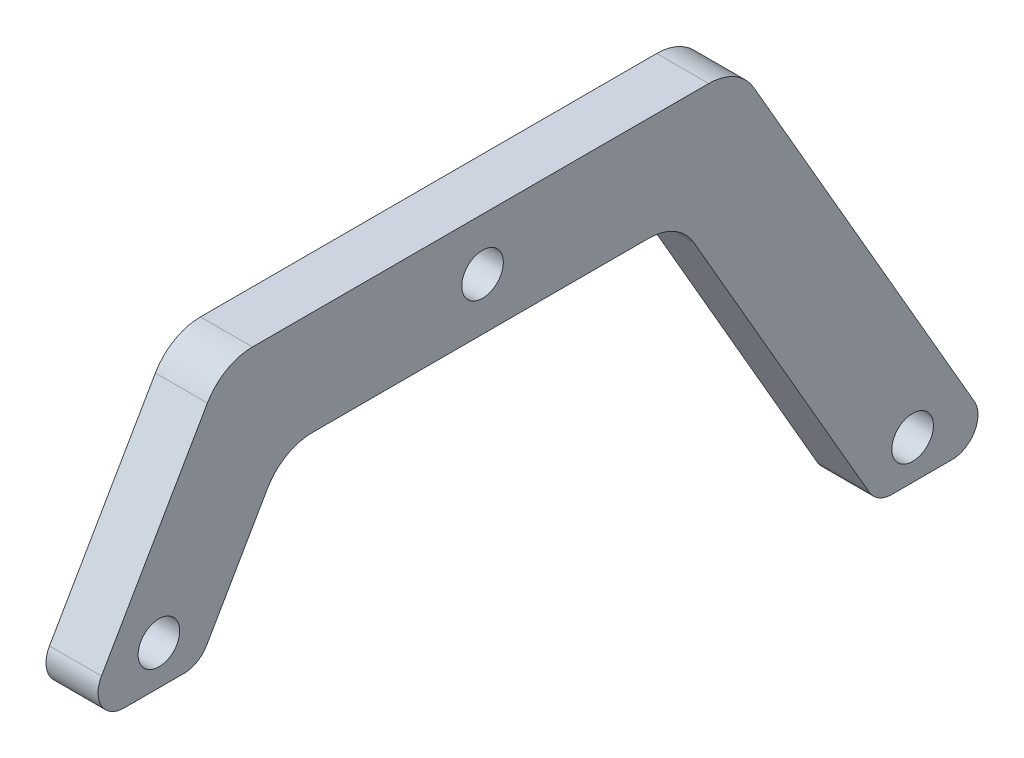
ISO-10303-21;
HEADER;
FILE_DESCRIPTION(('STEP AP214'),'2;1');
FILE_NAME('part.step','',(''),(''),'','','');
FILE_SCHEMA(('AUTOMOTIVE_DESIGN { 1 0 10303 214 1 1 1 1 }'));
ENDSEC;
DATA;
#1=APPLICATION_CONTEXT('core data for automotive mechanical design processes');
#2=APPLICATION_PROTOCOL_DEFINITION('international standard','automotive_design',2000,#1);
#3=PRODUCT_CONTEXT('',#1,'mechanical');
#4=PRODUCT('Part','Part','',(#3));
#5=PRODUCT_RELATED_PRODUCT_CATEGORY('part','',(#4));
#6=PRODUCT_DEFINITION_FORMATION('','',#4);
#7=PRODUCT_DEFINITION_CONTEXT('part definition',#1,'design');
#8=PRODUCT_DEFINITION('design','',#6,#7);
#9=PRODUCT_DEFINITION_SHAPE('','',#8);
#10=(LENGTH_UNIT() NAMED_UNIT(*) SI_UNIT(.MILLI.,.METRE.));
#11=(NAMED_UNIT(*) PLANE_ANGLE_UNIT() SI_UNIT($,.RADIAN.));
#12=(NAMED_UNIT(*) SI_UNIT($,.STERADIAN.) SOLID_ANGLE_UNIT());
#13=UNCERTAINTY_MEASURE_WITH_UNIT(LENGTH_MEASURE(1.E-05),#10,'distance_accuracy_value','');
#14=(GEOMETRIC_REPRESENTATION_CONTEXT(3) GLOBAL_UNCERTAINTY_ASSIGNED_CONTEXT((#13)) GLOBAL_UNIT_ASSIGNED_CONTEXT((#10,
#11,#12)) REPRESENTATION_CONTEXT('',''));
#15=CARTESIAN_POINT('',(0.,0.,0.));
#16=DIRECTION('',(0.,0.,1.));
#17=DIRECTION('',(1.,0.,0.));
#18=AXIS2_PLACEMENT_3D('',#15,#16,#17);
#19=CARTESIAN_POINT('',(20.,127.574851285857,-114.228325360805));
#20=DIRECTION('',(-1.,0.,0.));
#21=DIRECTION('',(0.,0.,1.));
#22=AXIS2_PLACEMENT_3D('',#19,#20,#21);
#23=PLANE('',#22);
#24=CARTESIAN_POINT('',(20.,127.574851285857,-114.228325360805));
#25=DIRECTION('',(1.,0.,0.));
#26=DIRECTION('',(0.,0.,1.));
#27=AXIS2_PLACEMENT_3D('',#24,#25,#26);
#28=CIRCLE('',#27,20.0000000000001);
#29=CARTESIAN_POINT('',(20.,137.574851285857,-131.548833436493));
#30=VERTEX_POINT('',#29);
#31=CARTESIAN_POINT('',(20.,147.574851285857,-114.228325360805));
#32=VERTEX_POINT('',#31);
#33=EDGE_CURVE('E217',#30,#32,#28,.T.);
#34=ORIENTED_EDGE('',*,*,#33,.T.);
#35=DIRECTION('',(0.,0.,1.));
#36=VECTOR('',#35,1.);
#37=CARTESIAN_POINT('',(20.,147.574851285857,61.1416228554857));
#38=LINE('',#37,#36);
#39=CARTESIAN_POINT('',(20.,147.574851285857,61.1416228554857));
#40=VERTEX_POINT('',#39);
#41=EDGE_CURVE('E125',#32,#40,#38,.T.);
#42=ORIENTED_EDGE('',*,*,#41,.T.);
#43=CARTESIAN_POINT('',(20.,127.574851285857,61.1416228554857));
#44=DIRECTION('',(1.,0.,0.));
#45=DIRECTION('',(0.,0.,1.));
#46=AXIS2_PLACEMENT_3D('',#43,#44,#45);
#47=CIRCLE('',#46,20.0000000000001);
#48=CARTESIAN_POINT('',(20.,137.574851285857,78.4621309311745));
#49=VERTEX_POINT('',#48);
#50=EDGE_CURVE('E256',#40,#49,#47,.T.);
#51=ORIENTED_EDGE('',*,*,#50,.T.);
#52=DIRECTION('',(0.,-0.86602540378444,0.499999999999997));
#53=VECTOR('',#52,1.);
#54=CARTESIAN_POINT('',(20.,67.0522492484334,119.178374201434));
#55=LINE('',#54,#53);
#56=CARTESIAN_POINT('',(20.,67.0522492484334,119.178374201434));
#57=VERTEX_POINT('',#56);
#58=EDGE_CURVE('E275',#49,#57,#55,.T.);
#59=ORIENTED_EDGE('',*,*,#58,.T.);
#60=CARTESIAN_POINT('',(20.,62.0522492484333,110.518120163589));
#61=DIRECTION('',(1.,0.,0.));
#62=DIRECTION('',(0.,0.,-1.));
#63=AXIS2_PLACEMENT_3D('',#60,#61,#62);
#64=CIRCLE('',#63,10.);
#65=CARTESIAN_POINT('',(20.,52.0522492484333,110.518120163589));
#66=VERTEX_POINT('',#65);
#67=EDGE_CURVE('E272',#57,#66,#64,.T.);
#68=ORIENTED_EDGE('',*,*,#67,.T.);
#69=DIRECTION('',(0.,0.,-1.));
#70=VECTOR('',#69,1.);
#71=CARTESIAN_POINT('',(20.,52.0522492484334,87.4241093960043));
#72=LINE('',#71,#70);
#73=CARTESIAN_POINT('',(20.,52.0522492484334,87.4241093960043));
#74=VERTEX_POINT('',#73);
#75=EDGE_CURVE('E274',#66,#74,#72,.T.);
#76=ORIENTED_EDGE('',*,*,#75,.T.);
#77=CARTESIAN_POINT('',(20.,62.0522492484333,87.4241093960043));
#78=DIRECTION('',(1.,0.,0.));
#79=DIRECTION('',(0.,0.,1.));
#80=AXIS2_PLACEMENT_3D('',#77,#78,#79);
#81=CIRCLE('',#80,9.99999999999995);
#82=CARTESIAN_POINT('',(20.,57.0522492484334,78.7638553581599));
#83=VERTEX_POINT('',#82);
#84=EDGE_CURVE('E277',#74,#83,#81,.T.);
#85=ORIENTED_EDGE('',*,*,#84,.T.);
#86=DIRECTION('',(0.,0.86602540378444,-0.499999999999998));
#87=VECTOR('',#86,1.);
#88=CARTESIAN_POINT('',(20.,97.5748512858571,55.3681201635894));
#89=LINE('',#88,#87);
#90=CARTESIAN_POINT('',(20.,97.5748512858571,55.3681201635894));
#91=VERTEX_POINT('',#90);
#92=EDGE_CURVE('E283',#83,#91,#89,.T.);
#93=ORIENTED_EDGE('',*,*,#92,.T.);
#94=CARTESIAN_POINT('',(20.,87.5748512858571,38.0476120879007));
#95=DIRECTION('',(-1.,0.,0.));
#96=DIRECTION('',(0.,0.,-1.));
#97=AXIS2_PLACEMENT_3D('',#94,#95,#96);
#98=CIRCLE('',#97,20.0000000000001);
#99=CARTESIAN_POINT('',(20.,107.574851285857,38.0476120879006));
#100=VERTEX_POINT('',#99);
#101=EDGE_CURVE('E285',#91,#100,#98,.T.);
#102=ORIENTED_EDGE('',*,*,#101,.T.);
#103=DIRECTION('',(0.,0.,-1.));
#104=VECTOR('',#103,1.);
#105=CARTESIAN_POINT('',(20.,107.574851285857,-91.1343145932195));
#106=LINE('',#105,#104);
#107=CARTESIAN_POINT('',(20.,107.574851285857,-91.1343145932195));
#108=VERTEX_POINT('',#107);
#109=EDGE_CURVE('E287',#100,#108,#106,.T.);
#110=ORIENTED_EDGE('',*,*,#109,.T.);
#111=CARTESIAN_POINT('',(20.,87.5748512858571,-91.1343145932196));
#112=DIRECTION('',(-1.,0.,0.));
#113=DIRECTION('',(0.,0.,-1.));
#114=AXIS2_PLACEMENT_3D('',#111,#112,#113);
#115=CIRCLE('',#114,20.0000000000001);
#116=CARTESIAN_POINT('',(20.,97.5748512858574,-108.454822668908));
#117=VERTEX_POINT('',#116);
#118=EDGE_CURVE('E289',#108,#117,#115,.T.);
#119=ORIENTED_EDGE('',*,*,#118,.T.);
#120=DIRECTION('',(0.,-0.866025403784439,-0.499999999999998));
#121=VECTOR('',#120,1.);
#122=CARTESIAN_POINT('',(20.,-19.4177939057322,-176.000557863479));
#123=LINE('',#122,#121);
#124=CARTESIAN_POINT('',(20.,-19.4177939057322,-176.000557863479));
#125=VERTEX_POINT('',#124);
#126=EDGE_CURVE('E291',#117,#125,#123,.T.);
#127=ORIENTED_EDGE('',*,*,#126,.T.);
#128=CARTESIAN_POINT('',(20.,-14.4177939057325,-184.660811901323));
#129=DIRECTION('',(1.,0.,0.));
#130=DIRECTION('',(0.,0.,1.));
#131=AXIS2_PLACEMENT_3D('',#128,#129,#130);
#132=CIRCLE('',#131,9.99999999999977);
#133=CARTESIAN_POINT('',(20.,-24.4177939057323,-184.660811901323));
#134=VERTEX_POINT('',#133);
#135=EDGE_CURVE('E168',#125,#134,#132,.T.);
#136=ORIENTED_EDGE('',*,*,#135,.T.);
#137=DIRECTION('',(0.,0.,-1.));
#138=VECTOR('',#137,1.);
#139=CARTESIAN_POINT('',(20.,-24.4177939057325,-207.754822668908));
#140=LINE('',#139,#138);
#141=CARTESIAN_POINT('',(20.,-24.4177939057325,-207.754822668908));
#142=VERTEX_POINT('',#141);
#143=EDGE_CURVE('E162',#134,#142,#140,.T.);
#144=ORIENTED_EDGE('',*,*,#143,.T.);
#145=CARTESIAN_POINT('',(20.,-14.4177939057325,-207.754822668908));
#146=DIRECTION('',(1.,0.,0.));
#147=DIRECTION('',(0.,0.,1.));
#148=AXIS2_PLACEMENT_3D('',#145,#146,#147);
#149=CIRCLE('',#148,9.99999999999998);
#150=CARTESIAN_POINT('',(20.,-9.41779390573253,-216.415076706752));
#151=VERTEX_POINT('',#150);
#152=EDGE_CURVE('E166',#142,#151,#149,.T.);
#153=ORIENTED_EDGE('',*,*,#152,.T.);
#154=DIRECTION('',(0.,0.86602540378444,0.499999999999998));
#155=VECTOR('',#154,1.);
#156=CARTESIAN_POINT('',(20.,137.574851285857,-131.548833436493));
#157=LINE('',#156,#155);
#158=EDGE_CURVE('E58',#151,#30,#157,.T.);
#159=ORIENTED_EDGE('',*,*,#158,.T.);
#160=EDGE_LOOP('',(#34,#42,#51,#59,#68,#76,#85,#93,#102,#110,#119,#127,#136,#144,#153,#159));
#161=FACE_BOUND('',#160,.T.);
#162=CARTESIAN_POINT('',(20.,127.574851285857,-27.2934165204568));
#163=DIRECTION('',(1.,0.,0.));
#164=DIRECTION('',(0.,0.,-1.));
#165=AXIS2_PLACEMENT_3D('',#162,#163,#164);
#166=CIRCLE('',#165,8.);
#167=CARTESIAN_POINT('',(20.,127.574851285857,-35.2934165204568));
#168=VERTEX_POINT('',#167);
#169=EDGE_CURVE('E190',#168,#168,#166,.T.);
#170=ORIENTED_EDGE('',*,*,#169,.F.);
#171=EDGE_LOOP('',(#170));
#172=FACE_BOUND('',#171,.T.);
#173=CARTESIAN_POINT('',(20.,67.0522492484334,97.1009275687129));
#174=DIRECTION('',(1.,0.,0.));
#175=DIRECTION('',(0.,0.,-1.));
#176=AXIS2_PLACEMENT_3D('',#173,#174,#175);
#177=CIRCLE('',#176,8.00000000000001);
#178=CARTESIAN_POINT('',(20.,67.0522492484334,89.1009275687128));
#179=VERTEX_POINT('',#178);
#180=EDGE_CURVE('E345',#179,#179,#177,.T.);
#181=ORIENTED_EDGE('',*,*,#180,.F.);
#182=EDGE_LOOP('',(#181));
#183=FACE_BOUND('',#182,.T.);
#184=CARTESIAN_POINT('',(20.,-9.41779390573252,-192.620942211618));
#185=DIRECTION('',(1.,0.,0.));
#186=DIRECTION('',(0.,0.,-1.));
#187=AXIS2_PLACEMENT_3D('',#184,#185,#186);
#188=CIRCLE('',#187,8.00000000000001);
#189=CARTESIAN_POINT('',(20.,-9.41779390573252,-200.620942211618));
#190=VERTEX_POINT('',#189);
#191=EDGE_CURVE('E336',#190,#190,#188,.T.);
#192=ORIENTED_EDGE('',*,*,#191,.F.);
#193=EDGE_LOOP('',(#192));
#194=FACE_BOUND('',#193,.T.);
#195=ADVANCED_FACE('F41',(#161,#172,#183,#194),#23,.F.);
#196=CARTESIAN_POINT('',(0.,127.574851285857,-114.228325360805));
#197=DIRECTION('',(-1.,0.,0.));
#198=DIRECTION('',(0.,0.,1.));
#199=AXIS2_PLACEMENT_3D('',#196,#197,#198);
#200=PLANE('',#199);
#201=CARTESIAN_POINT('',(0.,67.0522492484334,97.1009275687129));
#202=DIRECTION('',(1.,0.,0.));
#203=DIRECTION('',(0.,0.,-1.));
#204=AXIS2_PLACEMENT_3D('',#201,#202,#203);
#205=CIRCLE('',#204,8.00000000000001);
#206=CARTESIAN_POINT('',(0.,67.0522492484334,89.1009275687128));
#207=VERTEX_POINT('',#206);
#208=EDGE_CURVE('E342',#207,#207,#205,.T.);
#209=ORIENTED_EDGE('',*,*,#208,.T.);
#210=EDGE_LOOP('',(#209));
#211=FACE_BOUND('',#210,.T.);
#212=CARTESIAN_POINT('',(0.,127.574851285857,-114.228325360805));
#213=DIRECTION('',(1.,0.,0.));
#214=DIRECTION('',(0.,0.,1.));
#215=AXIS2_PLACEMENT_3D('',#212,#213,#214);
#216=CIRCLE('',#215,20.0000000000001);
#217=CARTESIAN_POINT('',(0.,137.574851285857,-131.548833436493));
#218=VERTEX_POINT('',#217);
#219=CARTESIAN_POINT('',(0.,147.574851285857,-114.228325360805));
#220=VERTEX_POINT('',#219);
#221=EDGE_CURVE('E186',#218,#220,#216,.T.);
#222=ORIENTED_EDGE('',*,*,#221,.F.);
#223=DIRECTION('',(0.,0.86602540378444,0.499999999999998));
#224=VECTOR('',#223,1.);
#225=CARTESIAN_POINT('',(0.,137.574851285857,-131.548833436493));
#226=LINE('',#225,#224);
#227=CARTESIAN_POINT('',(0.,-9.41779390573253,-216.415076706752));
#228=VERTEX_POINT('',#227);
#229=EDGE_CURVE('E117',#228,#218,#226,.T.);
#230=ORIENTED_EDGE('',*,*,#229,.F.);
#231=CARTESIAN_POINT('',(0.,-14.4177939057325,-207.754822668908));
#232=DIRECTION('',(1.,0.,0.));
#233=DIRECTION('',(0.,0.,1.));
#234=AXIS2_PLACEMENT_3D('',#231,#232,#233);
#235=CIRCLE('',#234,9.99999999999998);
#236=CARTESIAN_POINT('',(0.,-24.4177939057325,-207.754822668908));
#237=VERTEX_POINT('',#236);
#238=EDGE_CURVE('E111',#237,#228,#235,.T.);
#239=ORIENTED_EDGE('',*,*,#238,.F.);
#240=DIRECTION('',(0.,0.,-1.));
#241=VECTOR('',#240,1.);
#242=CARTESIAN_POINT('',(0.,-24.4177939057325,-207.754822668908));
#243=LINE('',#242,#241);
#244=CARTESIAN_POINT('',(0.,-24.4177939057323,-184.660811901323));
#245=VERTEX_POINT('',#244);
#246=EDGE_CURVE('E176',#245,#237,#243,.T.);
#247=ORIENTED_EDGE('',*,*,#246,.F.);
#248=CARTESIAN_POINT('',(0.,-14.4177939057325,-184.660811901323));
#249=DIRECTION('',(1.,0.,0.));
#250=DIRECTION('',(0.,0.,1.));
#251=AXIS2_PLACEMENT_3D('',#248,#249,#250);
#252=CIRCLE('',#251,9.99999999999977);
#253=CARTESIAN_POINT('',(0.,-19.4177939057322,-176.000557863479));
#254=VERTEX_POINT('',#253);
#255=EDGE_CURVE('E212',#254,#245,#252,.T.);
#256=ORIENTED_EDGE('',*,*,#255,.F.);
#257=DIRECTION('',(0.,-0.866025403784439,-0.499999999999998));
#258=VECTOR('',#257,1.);
#259=CARTESIAN_POINT('',(0.,-19.4177939057322,-176.000557863479));
#260=LINE('',#259,#258);
#261=CARTESIAN_POINT('',(0.,97.5748512858574,-108.454822668908));
#262=VERTEX_POINT('',#261);
#263=EDGE_CURVE('E210',#262,#254,#260,.T.);
#264=ORIENTED_EDGE('',*,*,#263,.F.);
#265=CARTESIAN_POINT('',(0.,87.5748512858571,-91.1343145932196));
#266=DIRECTION('',(-1.,0.,0.));
#267=DIRECTION('',(0.,0.,-1.));
#268=AXIS2_PLACEMENT_3D('',#265,#266,#267);
#269=CIRCLE('',#268,20.0000000000001);
#270=CARTESIAN_POINT('',(0.,107.574851285857,-91.1343145932195));
#271=VERTEX_POINT('',#270);
#272=EDGE_CURVE('E208',#271,#262,#269,.T.);
#273=ORIENTED_EDGE('',*,*,#272,.F.);
#274=DIRECTION('',(0.,0.,-1.));
#275=VECTOR('',#274,1.);
#276=CARTESIAN_POINT('',(0.,107.574851285857,-91.1343145932195));
#277=LINE('',#276,#275);
#278=CARTESIAN_POINT('',(0.,107.574851285857,38.0476120879006));
#279=VERTEX_POINT('',#278);
#280=EDGE_CURVE('E206',#279,#271,#277,.T.);
#281=ORIENTED_EDGE('',*,*,#280,.F.);
#282=CARTESIAN_POINT('',(0.,87.5748512858571,38.0476120879007));
#283=DIRECTION('',(-1.,0.,0.));
#284=DIRECTION('',(0.,0.,-1.));
#285=AXIS2_PLACEMENT_3D('',#282,#283,#284);
#286=CIRCLE('',#285,20.0000000000001);
#287=CARTESIAN_POINT('',(0.,97.5748512858571,55.3681201635894));
#288=VERTEX_POINT('',#287);
#289=EDGE_CURVE('E204',#288,#279,#286,.T.);
#290=ORIENTED_EDGE('',*,*,#289,.F.);
#291=DIRECTION('',(0.,0.86602540378444,-0.499999999999998));
#292=VECTOR('',#291,1.);
#293=CARTESIAN_POINT('',(0.,97.5748512858571,55.3681201635894));
#294=LINE('',#293,#292);
#295=CARTESIAN_POINT('',(0.,57.0522492484334,78.7638553581599));
#296=VERTEX_POINT('',#295);
#297=EDGE_CURVE('E202',#296,#288,#294,.T.);
#298=ORIENTED_EDGE('',*,*,#297,.F.);
#299=CARTESIAN_POINT('',(0.,62.0522492484333,87.4241093960043));
#300=DIRECTION('',(1.,0.,0.));
#301=DIRECTION('',(0.,0.,1.));
#302=AXIS2_PLACEMENT_3D('',#299,#300,#301);
#303=CIRCLE('',#302,9.99999999999995);
#304=CARTESIAN_POINT('',(0.,52.0522492484334,87.4241093960043));
#305=VERTEX_POINT('',#304);
#306=EDGE_CURVE('E200',#305,#296,#303,.T.);
#307=ORIENTED_EDGE('',*,*,#306,.F.);
#308=DIRECTION('',(0.,0.,-1.));
#309=VECTOR('',#308,1.);
#310=CARTESIAN_POINT('',(0.,52.0522492484334,87.4241093960043));
#311=LINE('',#310,#309);
#312=CARTESIAN_POINT('',(0.,52.0522492484333,110.518120163589));
#313=VERTEX_POINT('',#312);
#314=EDGE_CURVE('E198',#313,#305,#311,.T.);
#315=ORIENTED_EDGE('',*,*,#314,.F.);
#316=CARTESIAN_POINT('',(0.,62.0522492484333,110.518120163589));
#317=DIRECTION('',(1.,0.,0.));
#318=DIRECTION('',(0.,0.,-1.));
#319=AXIS2_PLACEMENT_3D('',#316,#317,#318);
#320=CIRCLE('',#319,10.);
#321=CARTESIAN_POINT('',(0.,67.0522492484334,119.178374201434));
#322=VERTEX_POINT('',#321);
#323=EDGE_CURVE('E196',#322,#313,#320,.T.);
#324=ORIENTED_EDGE('',*,*,#323,.F.);
#325=DIRECTION('',(0.,-0.86602540378444,0.499999999999997));
#326=VECTOR('',#325,1.);
#327=CARTESIAN_POINT('',(0.,67.0522492484334,119.178374201434));
#328=LINE('',#327,#326);
#329=CARTESIAN_POINT('',(0.,137.574851285857,78.4621309311745));
#330=VERTEX_POINT('',#329);
#331=EDGE_CURVE('E194',#330,#322,#328,.T.);
#332=ORIENTED_EDGE('',*,*,#331,.F.);
#333=CARTESIAN_POINT('',(0.,127.574851285857,61.1416228554857));
#334=DIRECTION('',(1.,0.,0.));
#335=DIRECTION('',(0.,0.,1.));
#336=AXIS2_PLACEMENT_3D('',#333,#334,#335);
#337=CIRCLE('',#336,20.0000000000001);
#338=CARTESIAN_POINT('',(0.,147.574851285857,61.1416228554857));
#339=VERTEX_POINT('',#338);
#340=EDGE_CURVE('E192',#339,#330,#337,.T.);
#341=ORIENTED_EDGE('',*,*,#340,.F.);
#342=DIRECTION('',(0.,0.,1.));
#343=VECTOR('',#342,1.);
#344=CARTESIAN_POINT('',(0.,147.574851285857,61.1416228554857));
#345=LINE('',#344,#343);
#346=EDGE_CURVE('E189',#220,#339,#345,.T.);
#347=ORIENTED_EDGE('',*,*,#346,.F.);
#348=EDGE_LOOP('',(#222,#230,#239,#247,#256,#264,#273,#281,#290,#298,#307,#315,#324,#332,#341,#347));
#349=FACE_BOUND('',#348,.T.);
#350=CARTESIAN_POINT('',(0.,127.574851285857,-27.2934165204568));
#351=DIRECTION('',(1.,0.,0.));
#352=DIRECTION('',(0.,0.,-1.));
#353=AXIS2_PLACEMENT_3D('',#350,#351,#352);
#354=CIRCLE('',#353,8.);
#355=CARTESIAN_POINT('',(0.,127.574851285857,-35.2934165204568));
#356=VERTEX_POINT('',#355);
#357=EDGE_CURVE('E348',#356,#356,#354,.T.);
#358=ORIENTED_EDGE('',*,*,#357,.T.);
#359=EDGE_LOOP('',(#358));
#360=FACE_BOUND('',#359,.T.);
#361=CARTESIAN_POINT('',(0.,-9.41779390573252,-192.620942211618));
#362=DIRECTION('',(1.,0.,0.));
#363=DIRECTION('',(0.,0.,-1.));
#364=AXIS2_PLACEMENT_3D('',#361,#362,#363);
#365=CIRCLE('',#364,8.00000000000001);
#366=CARTESIAN_POINT('',(0.,-9.41779390573252,-200.620942211618));
#367=VERTEX_POINT('',#366);
#368=EDGE_CURVE('E339',#367,#367,#365,.T.);
#369=ORIENTED_EDGE('',*,*,#368,.T.);
#370=EDGE_LOOP('',(#369));
#371=FACE_BOUND('',#370,.T.);
#372=ADVANCED_FACE('F260',(#211,#349,#360,#371),#200,.T.);
#373=CARTESIAN_POINT('',(20.,127.574851285857,-114.228325360805));
#374=DIRECTION('',(-1.,0.,0.));
#375=DIRECTION('',(0.,0.,1.));
#376=AXIS2_PLACEMENT_3D('',#373,#374,#375);
#377=CYLINDRICAL_SURFACE('',#376,20.0000000000001);
#378=ORIENTED_EDGE('',*,*,#221,.T.);
#379=DIRECTION('',(-1.,0.,0.));
#380=VECTOR('',#379,1.);
#381=CARTESIAN_POINT('',(20.,147.574851285857,-114.228325360805));
#382=LINE('',#381,#380);
#383=EDGE_CURVE('E11',#32,#220,#382,.T.);
#384=ORIENTED_EDGE('',*,*,#383,.F.);
#385=ORIENTED_EDGE('',*,*,#33,.F.);
#386=DIRECTION('',(-1.,0.,0.));
#387=VECTOR('',#386,1.);
#388=CARTESIAN_POINT('',(20.,137.574851285857,-131.548833436493));
#389=LINE('',#388,#387);
#390=EDGE_CURVE('E182',#30,#218,#389,.T.);
#391=ORIENTED_EDGE('',*,*,#390,.T.);
#392=EDGE_LOOP('',(#378,#384,#385,#391));
#393=FACE_BOUND('',#392,.T.);
#394=ADVANCED_FACE('F43',(#393),#377,.T.);
#395=CARTESIAN_POINT('',(20.,147.574851285857,61.1416228554857));
#396=DIRECTION('',(0.,-1.,0.));
#397=DIRECTION('',(0.,0.,-1.));
#398=AXIS2_PLACEMENT_3D('',#395,#396,#397);
#399=PLANE('',#398);
#400=ORIENTED_EDGE('',*,*,#346,.T.);
#401=DIRECTION('',(-1.,0.,0.));
#402=VECTOR('',#401,1.);
#403=CARTESIAN_POINT('',(20.,147.574851285857,61.1416228554857));
#404=LINE('',#403,#402);
#405=EDGE_CURVE('E50',#40,#339,#404,.T.);
#406=ORIENTED_EDGE('',*,*,#405,.F.);
#407=ORIENTED_EDGE('',*,*,#41,.F.);
#408=ORIENTED_EDGE('',*,*,#383,.T.);
#409=EDGE_LOOP('',(#400,#406,#407,#408));
#410=FACE_BOUND('',#409,.T.);
#411=ADVANCED_FACE('F505',(#410),#399,.F.);
#412=CARTESIAN_POINT('',(20.,127.574851285857,61.1416228554857));
#413=DIRECTION('',(-1.,0.,0.));
#414=DIRECTION('',(0.,0.,1.));
#415=AXIS2_PLACEMENT_3D('',#412,#413,#414);
#416=CYLINDRICAL_SURFACE('',#415,20.0000000000001);
#417=ORIENTED_EDGE('',*,*,#340,.T.);
#418=DIRECTION('',(-1.,0.,0.));
#419=VECTOR('',#418,1.);
#420=CARTESIAN_POINT('',(20.,137.574851285857,78.4621309311745));
#421=LINE('',#420,#419);
#422=EDGE_CURVE('E248',#49,#330,#421,.T.);
#423=ORIENTED_EDGE('',*,*,#422,.F.);
#424=ORIENTED_EDGE('',*,*,#50,.F.);
#425=ORIENTED_EDGE('',*,*,#405,.T.);
#426=EDGE_LOOP('',(#417,#423,#424,#425));
#427=FACE_BOUND('',#426,.T.);
#428=ADVANCED_FACE('F254',(#427),#416,.T.);
#429=CARTESIAN_POINT('',(20.,67.0522492484334,119.178374201434));
#430=DIRECTION('',(0.,-0.499999999999997,-0.86602540378444));
#431=DIRECTION('',(0.,0.86602540378444,-0.499999999999998));
#432=AXIS2_PLACEMENT_3D('',#429,#430,#431);
#433=PLANE('',#432);
#434=ORIENTED_EDGE('',*,*,#331,.T.);
#435=DIRECTION('',(-1.,0.,0.));
#436=VECTOR('',#435,1.);
#437=CARTESIAN_POINT('',(20.,67.0522492484334,119.178374201434));
#438=LINE('',#437,#436);
#439=EDGE_CURVE('E245',#57,#322,#438,.T.);
#440=ORIENTED_EDGE('',*,*,#439,.F.);
#441=ORIENTED_EDGE('',*,*,#58,.F.);
#442=ORIENTED_EDGE('',*,*,#422,.T.);
#443=EDGE_LOOP('',(#434,#440,#441,#442));
#444=FACE_BOUND('',#443,.T.);
#445=ADVANCED_FACE('F266',(#444),#433,.F.);
#446=CARTESIAN_POINT('',(20.,62.0522492484333,110.518120163589));
#447=DIRECTION('',(-1.,0.,0.));
#448=DIRECTION('',(0.,0.,1.));
#449=AXIS2_PLACEMENT_3D('',#446,#447,#448);
#450=CYLINDRICAL_SURFACE('',#449,10.);
#451=ORIENTED_EDGE('',*,*,#323,.T.);
#452=DIRECTION('',(-1.,0.,0.));
#453=VECTOR('',#452,1.);
#454=CARTESIAN_POINT('',(20.,52.0522492484333,110.518120163589));
#455=LINE('',#454,#453);
#456=EDGE_CURVE('E242',#66,#313,#455,.T.);
#457=ORIENTED_EDGE('',*,*,#456,.F.);
#458=ORIENTED_EDGE('',*,*,#67,.F.);
#459=ORIENTED_EDGE('',*,*,#439,.T.);
#460=EDGE_LOOP('',(#451,#457,#458,#459));
#461=FACE_BOUND('',#460,.T.);
#462=ADVANCED_FACE('F270',(#461),#450,.T.);
#463=CARTESIAN_POINT('',(20.,52.0522492484334,87.4241093960043));
#464=DIRECTION('',(0.,1.,0.));
#465=DIRECTION('',(0.,0.,1.));
#466=AXIS2_PLACEMENT_3D('',#463,#464,#465);
#467=PLANE('',#466);
#468=ORIENTED_EDGE('',*,*,#314,.T.);
#469=DIRECTION('',(-1.,0.,0.));
#470=VECTOR('',#469,1.);
#471=CARTESIAN_POINT('',(20.,52.0522492484334,87.4241093960043));
#472=LINE('',#471,#470);
#473=EDGE_CURVE('E239',#74,#305,#472,.T.);
#474=ORIENTED_EDGE('',*,*,#473,.F.);
#475=ORIENTED_EDGE('',*,*,#75,.F.);
#476=ORIENTED_EDGE('',*,*,#456,.T.);
#477=EDGE_LOOP('',(#468,#474,#475,#476));
#478=FACE_BOUND('',#477,.T.);
#479=ADVANCED_FACE('F466',(#478),#467,.F.);
#480=CARTESIAN_POINT('',(20.,62.0522492484333,87.4241093960043));
#481=DIRECTION('',(-1.,0.,0.));
#482=DIRECTION('',(0.,0.,1.));
#483=AXIS2_PLACEMENT_3D('',#480,#481,#482);
#484=CYLINDRICAL_SURFACE('',#483,9.99999999999995);
#485=ORIENTED_EDGE('',*,*,#306,.T.);
#486=DIRECTION('',(-1.,0.,0.));
#487=VECTOR('',#486,1.);
#488=CARTESIAN_POINT('',(20.,57.0522492484334,78.7638553581599));
#489=LINE('',#488,#487);
#490=EDGE_CURVE('E236',#83,#296,#489,.T.);
#491=ORIENTED_EDGE('',*,*,#490,.F.);
#492=ORIENTED_EDGE('',*,*,#84,.F.);
#493=ORIENTED_EDGE('',*,*,#473,.T.);
#494=EDGE_LOOP('',(#485,#491,#492,#493));
#495=FACE_BOUND('',#494,.T.);
#496=ADVANCED_FACE('F455',(#495),#484,.T.);
#497=CARTESIAN_POINT('',(20.,97.5748512858571,55.3681201635894));
#498=DIRECTION('',(0.,0.499999999999998,0.86602540378444));
#499=DIRECTION('',(0.,-0.86602540378444,0.499999999999998));
#500=AXIS2_PLACEMENT_3D('',#497,#498,#499);
#501=PLANE('',#500);
#502=ORIENTED_EDGE('',*,*,#297,.T.);
#503=DIRECTION('',(-1.,0.,0.));
#504=VECTOR('',#503,1.);
#505=CARTESIAN_POINT('',(20.,97.5748512858571,55.3681201635894));
#506=LINE('',#505,#504);
#507=EDGE_CURVE('E233',#91,#288,#506,.T.);
#508=ORIENTED_EDGE('',*,*,#507,.F.);
#509=ORIENTED_EDGE('',*,*,#92,.F.);
#510=ORIENTED_EDGE('',*,*,#490,.T.);
#511=EDGE_LOOP('',(#502,#508,#509,#510));
#512=FACE_BOUND('',#511,.T.);
#513=ADVANCED_FACE('F444',(#512),#501,.F.);
#514=CARTESIAN_POINT('',(20.,87.5748512858571,38.0476120879007));
#515=DIRECTION('',(-1.,0.,0.));
#516=DIRECTION('',(0.,0.,1.));
#517=AXIS2_PLACEMENT_3D('',#514,#515,#516);
#518=CYLINDRICAL_SURFACE('',#517,20.0000000000001);
#519=ORIENTED_EDGE('',*,*,#289,.T.);
#520=DIRECTION('',(-1.,0.,0.));
#521=VECTOR('',#520,1.);
#522=CARTESIAN_POINT('',(20.,107.574851285857,38.0476120879006));
#523=LINE('',#522,#521);
#524=EDGE_CURVE('E230',#100,#279,#523,.T.);
#525=ORIENTED_EDGE('',*,*,#524,.F.);
#526=ORIENTED_EDGE('',*,*,#101,.F.);
#527=ORIENTED_EDGE('',*,*,#507,.T.);
#528=EDGE_LOOP('',(#519,#525,#526,#527));
#529=FACE_BOUND('',#528,.T.);
#530=ADVANCED_FACE('F433',(#529),#518,.F.);
#531=CARTESIAN_POINT('',(20.,107.574851285857,-91.1343145932195));
#532=DIRECTION('',(0.,1.,0.));
#533=DIRECTION('',(0.,0.,1.));
#534=AXIS2_PLACEMENT_3D('',#531,#532,#533);
#535=PLANE('',#534);
#536=ORIENTED_EDGE('',*,*,#280,.T.);
#537=DIRECTION('',(-1.,0.,0.));
#538=VECTOR('',#537,1.);
#539=CARTESIAN_POINT('',(20.,107.574851285857,-91.1343145932195));
#540=LINE('',#539,#538);
#541=EDGE_CURVE('E227',#108,#271,#540,.T.);
#542=ORIENTED_EDGE('',*,*,#541,.F.);
#543=ORIENTED_EDGE('',*,*,#109,.F.);
#544=ORIENTED_EDGE('',*,*,#524,.T.);
#545=EDGE_LOOP('',(#536,#542,#543,#544));
#546=FACE_BOUND('',#545,.T.);
#547=ADVANCED_FACE('F422',(#546),#535,.F.);
#548=CARTESIAN_POINT('',(20.,87.5748512858571,-91.1343145932196));
#549=DIRECTION('',(-1.,0.,0.));
#550=DIRECTION('',(0.,0.,1.));
#551=AXIS2_PLACEMENT_3D('',#548,#549,#550);
#552=CYLINDRICAL_SURFACE('',#551,20.0000000000001);
#553=ORIENTED_EDGE('',*,*,#272,.T.);
#554=DIRECTION('',(-1.,0.,0.));
#555=VECTOR('',#554,1.);
#556=CARTESIAN_POINT('',(20.,97.5748512858574,-108.454822668908));
#557=LINE('',#556,#555);
#558=EDGE_CURVE('E224',#117,#262,#557,.T.);
#559=ORIENTED_EDGE('',*,*,#558,.F.);
#560=ORIENTED_EDGE('',*,*,#118,.F.);
#561=ORIENTED_EDGE('',*,*,#541,.T.);
#562=EDGE_LOOP('',(#553,#559,#560,#561));
#563=FACE_BOUND('',#562,.T.);
#564=ADVANCED_FACE('F412',(#563),#552,.F.);
#565=CARTESIAN_POINT('',(20.,-19.4177939057322,-176.000557863479));
#566=DIRECTION('',(0.,0.499999999999998,-0.866025403784439));
#567=DIRECTION('',(0.,0.86602540378444,0.499999999999999));
#568=AXIS2_PLACEMENT_3D('',#565,#566,#567);
#569=PLANE('',#568);
#570=ORIENTED_EDGE('',*,*,#263,.T.);
#571=DIRECTION('',(-1.,0.,0.));
#572=VECTOR('',#571,1.);
#573=CARTESIAN_POINT('',(20.,-19.4177939057322,-176.000557863479));
#574=LINE('',#573,#572);
#575=EDGE_CURVE('E221',#125,#254,#574,.T.);
#576=ORIENTED_EDGE('',*,*,#575,.F.);
#577=ORIENTED_EDGE('',*,*,#126,.F.);
#578=ORIENTED_EDGE('',*,*,#558,.T.);
#579=EDGE_LOOP('',(#570,#576,#577,#578));
#580=FACE_BOUND('',#579,.T.);
#581=ADVANCED_FACE('F297',(#580),#569,.F.);
#582=CARTESIAN_POINT('',(20.,-14.4177939057325,-184.660811901323));
#583=DIRECTION('',(-1.,0.,0.));
#584=DIRECTION('',(0.,0.,1.));
#585=AXIS2_PLACEMENT_3D('',#582,#583,#584);
#586=CYLINDRICAL_SURFACE('',#585,9.99999999999977);
#587=ORIENTED_EDGE('',*,*,#255,.T.);
#588=DIRECTION('',(-1.,0.,0.));
#589=VECTOR('',#588,1.);
#590=CARTESIAN_POINT('',(20.,-24.4177939057323,-184.660811901323));
#591=LINE('',#590,#589);
#592=EDGE_CURVE('E177',#134,#245,#591,.T.);
#593=ORIENTED_EDGE('',*,*,#592,.F.);
#594=ORIENTED_EDGE('',*,*,#135,.F.);
#595=ORIENTED_EDGE('',*,*,#575,.T.);
#596=EDGE_LOOP('',(#587,#593,#594,#595));
#597=FACE_BOUND('',#596,.T.);
#598=ADVANCED_FACE('F301',(#597),#586,.T.);
#599=CARTESIAN_POINT('',(20.,-24.4177939057325,-207.754822668908));
#600=DIRECTION('',(0.,1.,0.));
#601=DIRECTION('',(0.,0.,1.));
#602=AXIS2_PLACEMENT_3D('',#599,#600,#601);
#603=PLANE('',#602);
#604=ORIENTED_EDGE('',*,*,#246,.T.);
#605=DIRECTION('',(-1.,0.,0.));
#606=VECTOR('',#605,1.);
#607=CARTESIAN_POINT('',(20.,-24.4177939057325,-207.754822668908));
#608=LINE('',#607,#606);
#609=EDGE_CURVE('E173',#142,#237,#608,.T.);
#610=ORIENTED_EDGE('',*,*,#609,.F.);
#611=ORIENTED_EDGE('',*,*,#143,.F.);
#612=ORIENTED_EDGE('',*,*,#592,.T.);
#613=EDGE_LOOP('',(#604,#610,#611,#612));
#614=FACE_BOUND('',#613,.T.);
#615=ADVANCED_FACE('F174',(#614),#603,.F.);
#616=CARTESIAN_POINT('',(20.,-14.4177939057325,-207.754822668908));
#617=DIRECTION('',(-1.,0.,0.));
#618=DIRECTION('',(0.,0.,1.));
#619=AXIS2_PLACEMENT_3D('',#616,#617,#618);
#620=CYLINDRICAL_SURFACE('',#619,9.99999999999998);
#621=ORIENTED_EDGE('',*,*,#238,.T.);
#622=DIRECTION('',(-1.,0.,0.));
#623=VECTOR('',#622,1.);
#624=CARTESIAN_POINT('',(20.,-9.41779390573253,-216.415076706752));
#625=LINE('',#624,#623);
#626=EDGE_CURVE('E178',#151,#228,#625,.T.);
#627=ORIENTED_EDGE('',*,*,#626,.F.);
#628=ORIENTED_EDGE('',*,*,#152,.F.);
#629=ORIENTED_EDGE('',*,*,#609,.T.);
#630=EDGE_LOOP('',(#621,#627,#628,#629));
#631=FACE_BOUND('',#630,.T.);
#632=ADVANCED_FACE('F180',(#631),#620,.T.);
#633=CARTESIAN_POINT('',(20.,137.574851285857,-131.548833436493));
#634=DIRECTION('',(0.,-0.499999999999998,0.86602540378444));
#635=DIRECTION('',(0.,-0.86602540378444,-0.499999999999998));
#636=AXIS2_PLACEMENT_3D('',#633,#634,#635);
#637=PLANE('',#636);
#638=ORIENTED_EDGE('',*,*,#229,.T.);
#639=ORIENTED_EDGE('',*,*,#390,.F.);
#640=ORIENTED_EDGE('',*,*,#158,.F.);
#641=ORIENTED_EDGE('',*,*,#626,.T.);
#642=EDGE_LOOP('',(#638,#639,#640,#641));
#643=FACE_BOUND('',#642,.T.);
#644=ADVANCED_FACE('F305',(#643),#637,.F.);
#645=CARTESIAN_POINT('',(20.,127.574851285857,-27.2934165204568));
#646=DIRECTION('',(-1.,0.,0.));
#647=DIRECTION('',(0.,0.,1.));
#648=AXIS2_PLACEMENT_3D('',#645,#646,#647);
#649=CYLINDRICAL_SURFACE('',#648,8.);
#650=ORIENTED_EDGE('',*,*,#169,.T.);
#651=EDGE_LOOP('',(#650));
#652=FACE_BOUND('',#651,.T.);
#653=ORIENTED_EDGE('',*,*,#357,.F.);
#654=EDGE_LOOP('',(#653));
#655=FACE_BOUND('',#654,.T.);
#656=ADVANCED_FACE('F307',(#652,#655),#649,.F.);
#657=CARTESIAN_POINT('',(20.,67.0522492484334,97.1009275687129));
#658=DIRECTION('',(-1.,0.,0.));
#659=DIRECTION('',(0.,0.,1.));
#660=AXIS2_PLACEMENT_3D('',#657,#658,#659);
#661=CYLINDRICAL_SURFACE('',#660,8.00000000000001);
#662=ORIENTED_EDGE('',*,*,#180,.T.);
#663=EDGE_LOOP('',(#662));
#664=FACE_BOUND('',#663,.T.);
#665=ORIENTED_EDGE('',*,*,#208,.F.);
#666=EDGE_LOOP('',(#665));
#667=FACE_BOUND('',#666,.T.);
#668=ADVANCED_FACE('F313',(#664,#667),#661,.F.);
#669=CARTESIAN_POINT('',(20.,-9.41779390573252,-192.620942211618));
#670=DIRECTION('',(-1.,0.,0.));
#671=DIRECTION('',(0.,0.,1.));
#672=AXIS2_PLACEMENT_3D('',#669,#670,#671);
#673=CYLINDRICAL_SURFACE('',#672,8.00000000000001);
#674=ORIENTED_EDGE('',*,*,#191,.T.);
#675=EDGE_LOOP('',(#674));
#676=FACE_BOUND('',#675,.T.);
#677=ORIENTED_EDGE('',*,*,#368,.F.);
#678=EDGE_LOOP('',(#677));
#679=FACE_BOUND('',#678,.T.);
#680=ADVANCED_FACE('F327',(#676,#679),#673,.F.);
#681=CLOSED_SHELL('',(#195,#372,#394,#411,#428,#445,#462,#479,#496,#513,#530,#547,#564,#581,
#598,#615,#632,#644,#656,#668,#680));
#682=MANIFOLD_SOLID_BREP('B2',#681);
#683=ADVANCED_BREP_SHAPE_REPRESENTATION('',(#18,#682),#14);
#684=SHAPE_DEFINITION_REPRESENTATION(#9,#683);
ENDSEC;
END-ISO-10303-21;
